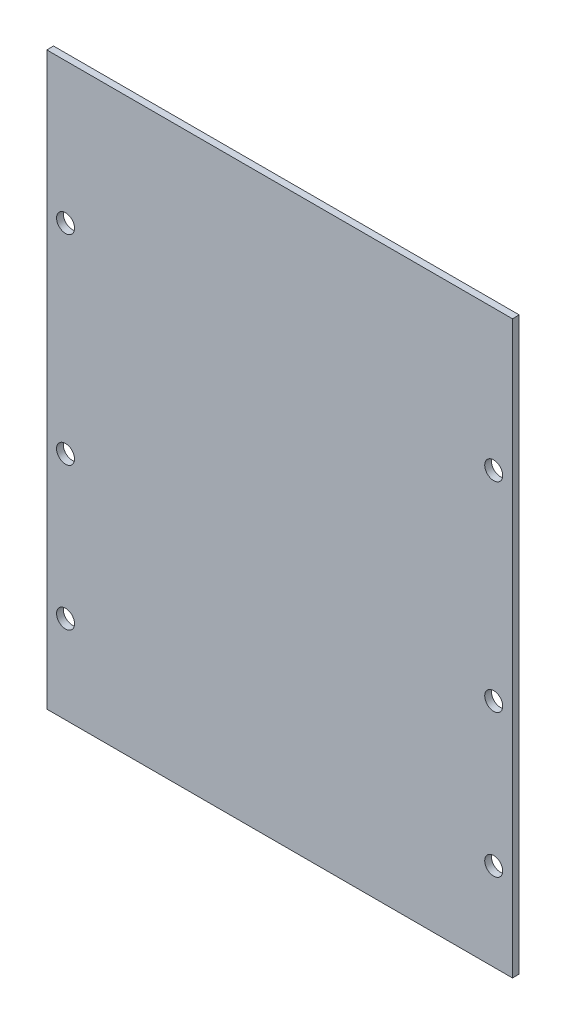
ISO-10303-21;
HEADER;
FILE_DESCRIPTION(('STEP AP214'),'2;1');
FILE_NAME('part.step','',(''),(''),'','','');
FILE_SCHEMA(('AUTOMOTIVE_DESIGN { 1 0 10303 214 1 1 1 1 }'));
ENDSEC;
DATA;
#1=APPLICATION_CONTEXT('core data for automotive mechanical design processes');
#2=APPLICATION_PROTOCOL_DEFINITION('international standard','automotive_design',2000,#1);
#3=PRODUCT_CONTEXT('',#1,'mechanical');
#4=PRODUCT('Part','Part','',(#3));
#5=PRODUCT_RELATED_PRODUCT_CATEGORY('part','',(#4));
#6=PRODUCT_DEFINITION_FORMATION('','',#4);
#7=PRODUCT_DEFINITION_CONTEXT('part definition',#1,'design');
#8=PRODUCT_DEFINITION('design','',#6,#7);
#9=PRODUCT_DEFINITION_SHAPE('','',#8);
#10=(LENGTH_UNIT() NAMED_UNIT(*) SI_UNIT(.MILLI.,.METRE.));
#11=(NAMED_UNIT(*) PLANE_ANGLE_UNIT() SI_UNIT($,.RADIAN.));
#12=(NAMED_UNIT(*) SI_UNIT($,.STERADIAN.) SOLID_ANGLE_UNIT());
#13=UNCERTAINTY_MEASURE_WITH_UNIT(LENGTH_MEASURE(1.E-05),#10,'distance_accuracy_value','');
#14=(GEOMETRIC_REPRESENTATION_CONTEXT(3) GLOBAL_UNCERTAINTY_ASSIGNED_CONTEXT((#13)) GLOBAL_UNIT_ASSIGNED_CONTEXT((#10,
#11,#12)) REPRESENTATION_CONTEXT('',''));
#15=CARTESIAN_POINT('',(0.,0.,0.));
#16=DIRECTION('',(0.,0.,1.));
#17=DIRECTION('',(1.,0.,0.));
#18=AXIS2_PLACEMENT_3D('',#15,#16,#17);
#19=CARTESIAN_POINT('',(0.,0.,1.5));
#20=DIRECTION('',(0.,0.,1.));
#21=DIRECTION('',(1.,0.,0.));
#22=AXIS2_PLACEMENT_3D('',#19,#20,#21);
#23=PLANE('',#22);
#24=CARTESIAN_POINT('',(47.625,-12.23,1.5));
#25=DIRECTION('',(0.,0.,1.));
#26=DIRECTION('',(1.,0.,0.));
#27=AXIS2_PLACEMENT_3D('',#24,#25,#26);
#28=CIRCLE('',#27,2.);
#29=CARTESIAN_POINT('',(49.625,-12.23,1.5));
#30=VERTEX_POINT('',#29);
#31=EDGE_CURVE('E137',#30,#30,#28,.T.);
#32=ORIENTED_EDGE('',*,*,#31,.F.);
#33=EDGE_LOOP('',(#32));
#34=FACE_BOUND('',#33,.T.);
#35=CARTESIAN_POINT('',(-47.625,32.22,1.5));
#36=DIRECTION('',(0.,0.,1.));
#37=DIRECTION('',(1.,0.,0.));
#38=AXIS2_PLACEMENT_3D('',#35,#36,#37);
#39=CIRCLE('',#38,2.);
#40=CARTESIAN_POINT('',(-45.625,32.22,1.5));
#41=VERTEX_POINT('',#40);
#42=EDGE_CURVE('E130',#41,#41,#39,.T.);
#43=ORIENTED_EDGE('',*,*,#42,.F.);
#44=EDGE_LOOP('',(#43));
#45=FACE_BOUND('',#44,.T.);
#46=CARTESIAN_POINT('',(-47.625,-43.98,1.5));
#47=DIRECTION('',(0.,0.,1.));
#48=DIRECTION('',(1.,0.,0.));
#49=AXIS2_PLACEMENT_3D('',#46,#47,#48);
#50=CIRCLE('',#49,2.);
#51=CARTESIAN_POINT('',(-45.625,-43.98,1.5));
#52=VERTEX_POINT('',#51);
#53=EDGE_CURVE('E108',#52,#52,#50,.T.);
#54=ORIENTED_EDGE('',*,*,#53,.F.);
#55=EDGE_LOOP('',(#54));
#56=FACE_BOUND('',#55,.T.);
#57=DIRECTION('',(1.,0.,0.));
#58=VECTOR('',#57,1.);
#59=CARTESIAN_POINT('',(51.8,-63.5,1.5));
#60=LINE('',#59,#58);
#61=CARTESIAN_POINT('',(-51.8,-63.5,1.5));
#62=VERTEX_POINT('',#61);
#63=CARTESIAN_POINT('',(51.8,-63.5,1.5));
#64=VERTEX_POINT('',#63);
#65=EDGE_CURVE('E91',#62,#64,#60,.T.);
#66=ORIENTED_EDGE('',*,*,#65,.T.);
#67=DIRECTION('',(0.,1.,0.));
#68=VECTOR('',#67,1.);
#69=CARTESIAN_POINT('',(51.8,63.5,1.5));
#70=LINE('',#69,#68);
#71=CARTESIAN_POINT('',(51.8,63.5,1.5));
#72=VERTEX_POINT('',#71);
#73=EDGE_CURVE('E86',#64,#72,#70,.T.);
#74=ORIENTED_EDGE('',*,*,#73,.T.);
#75=DIRECTION('',(-1.,0.,0.));
#76=VECTOR('',#75,1.);
#77=CARTESIAN_POINT('',(51.8,63.5,1.5));
#78=LINE('',#77,#76);
#79=CARTESIAN_POINT('',(-51.8,63.5,1.5));
#80=VERTEX_POINT('',#79);
#81=EDGE_CURVE('E87',#72,#80,#78,.T.);
#82=ORIENTED_EDGE('',*,*,#81,.T.);
#83=DIRECTION('',(0.,-1.,0.));
#84=VECTOR('',#83,1.);
#85=CARTESIAN_POINT('',(-51.8,63.5,1.5));
#86=LINE('',#85,#84);
#87=EDGE_CURVE('E57',#80,#62,#86,.T.);
#88=ORIENTED_EDGE('',*,*,#87,.T.);
#89=EDGE_LOOP('',(#66,#74,#82,#88));
#90=FACE_BOUND('',#89,.T.);
#91=CARTESIAN_POINT('',(-47.625,-12.23,1.5));
#92=DIRECTION('',(0.,0.,1.));
#93=DIRECTION('',(1.,0.,0.));
#94=AXIS2_PLACEMENT_3D('',#91,#92,#93);
#95=CIRCLE('',#94,2.);
#96=CARTESIAN_POINT('',(-45.625,-12.23,1.5));
#97=VERTEX_POINT('',#96);
#98=EDGE_CURVE('E123',#97,#97,#95,.T.);
#99=ORIENTED_EDGE('',*,*,#98,.F.);
#100=EDGE_LOOP('',(#99));
#101=FACE_BOUND('',#100,.T.);
#102=CARTESIAN_POINT('',(47.625,-43.98,1.5));
#103=DIRECTION('',(0.,0.,1.));
#104=DIRECTION('',(1.,0.,0.));
#105=AXIS2_PLACEMENT_3D('',#102,#103,#104);
#106=CIRCLE('',#105,2.);
#107=CARTESIAN_POINT('',(49.625,-43.98,1.5));
#108=VERTEX_POINT('',#107);
#109=EDGE_CURVE('E133',#108,#108,#106,.T.);
#110=ORIENTED_EDGE('',*,*,#109,.F.);
#111=EDGE_LOOP('',(#110));
#112=FACE_BOUND('',#111,.T.);
#113=CARTESIAN_POINT('',(47.625,32.22,1.5));
#114=DIRECTION('',(0.,0.,1.));
#115=DIRECTION('',(1.,0.,0.));
#116=AXIS2_PLACEMENT_3D('',#113,#114,#115);
#117=CIRCLE('',#116,2.);
#118=CARTESIAN_POINT('',(49.625,32.22,1.5));
#119=VERTEX_POINT('',#118);
#120=EDGE_CURVE('E144',#119,#119,#117,.T.);
#121=ORIENTED_EDGE('',*,*,#120,.F.);
#122=EDGE_LOOP('',(#121));
#123=FACE_BOUND('',#122,.T.);
#124=ADVANCED_FACE('F39',(#34,#45,#56,#90,#101,#112,#123),#23,.T.);
#125=CARTESIAN_POINT('',(0.,0.,0.));
#126=DIRECTION('',(0.,0.,1.));
#127=DIRECTION('',(1.,0.,0.));
#128=AXIS2_PLACEMENT_3D('',#125,#126,#127);
#129=PLANE('',#128);
#130=DIRECTION('',(1.,0.,0.));
#131=VECTOR('',#130,1.);
#132=CARTESIAN_POINT('',(51.8,-63.5,0.));
#133=LINE('',#132,#131);
#134=CARTESIAN_POINT('',(-51.8,-63.5,0.));
#135=VERTEX_POINT('',#134);
#136=CARTESIAN_POINT('',(51.8,-63.5,0.));
#137=VERTEX_POINT('',#136);
#138=EDGE_CURVE('E104',#135,#137,#133,.T.);
#139=ORIENTED_EDGE('',*,*,#138,.F.);
#140=DIRECTION('',(0.,-1.,0.));
#141=VECTOR('',#140,1.);
#142=CARTESIAN_POINT('',(-51.8,63.5,0.));
#143=LINE('',#142,#141);
#144=CARTESIAN_POINT('',(-51.8,63.5,0.));
#145=VERTEX_POINT('',#144);
#146=EDGE_CURVE('E80',#145,#135,#143,.T.);
#147=ORIENTED_EDGE('',*,*,#146,.F.);
#148=DIRECTION('',(-1.,0.,0.));
#149=VECTOR('',#148,1.);
#150=CARTESIAN_POINT('',(51.8,63.5,0.));
#151=LINE('',#150,#149);
#152=CARTESIAN_POINT('',(51.8,63.5,0.));
#153=VERTEX_POINT('',#152);
#154=EDGE_CURVE('E71',#153,#145,#151,.T.);
#155=ORIENTED_EDGE('',*,*,#154,.F.);
#156=DIRECTION('',(0.,1.,0.));
#157=VECTOR('',#156,1.);
#158=CARTESIAN_POINT('',(51.8,63.5,0.));
#159=LINE('',#158,#157);
#160=EDGE_CURVE('E94',#137,#153,#159,.T.);
#161=ORIENTED_EDGE('',*,*,#160,.F.);
#162=EDGE_LOOP('',(#139,#147,#155,#161));
#163=FACE_BOUND('',#162,.T.);
#164=CARTESIAN_POINT('',(-47.625,-43.98,0.));
#165=DIRECTION('',(0.,0.,1.));
#166=DIRECTION('',(1.,0.,0.));
#167=AXIS2_PLACEMENT_3D('',#164,#165,#166);
#168=CIRCLE('',#167,2.);
#169=CARTESIAN_POINT('',(-45.625,-43.98,0.));
#170=VERTEX_POINT('',#169);
#171=EDGE_CURVE('E116',#170,#170,#168,.T.);
#172=ORIENTED_EDGE('',*,*,#171,.T.);
#173=EDGE_LOOP('',(#172));
#174=FACE_BOUND('',#173,.T.);
#175=CARTESIAN_POINT('',(-47.625,-12.23,0.));
#176=DIRECTION('',(0.,0.,1.));
#177=DIRECTION('',(1.,0.,0.));
#178=AXIS2_PLACEMENT_3D('',#175,#176,#177);
#179=CIRCLE('',#178,2.);
#180=CARTESIAN_POINT('',(-45.625,-12.23,0.));
#181=VERTEX_POINT('',#180);
#182=EDGE_CURVE('E125',#181,#181,#179,.T.);
#183=ORIENTED_EDGE('',*,*,#182,.T.);
#184=EDGE_LOOP('',(#183));
#185=FACE_BOUND('',#184,.T.);
#186=CARTESIAN_POINT('',(-47.625,32.22,0.));
#187=DIRECTION('',(0.,0.,1.));
#188=DIRECTION('',(1.,0.,0.));
#189=AXIS2_PLACEMENT_3D('',#186,#187,#188);
#190=CIRCLE('',#189,2.);
#191=CARTESIAN_POINT('',(-45.625,32.22,0.));
#192=VERTEX_POINT('',#191);
#193=EDGE_CURVE('E127',#192,#192,#190,.T.);
#194=ORIENTED_EDGE('',*,*,#193,.T.);
#195=EDGE_LOOP('',(#194));
#196=FACE_BOUND('',#195,.T.);
#197=CARTESIAN_POINT('',(47.625,-43.98,0.));
#198=DIRECTION('',(0.,0.,1.));
#199=DIRECTION('',(1.,0.,0.));
#200=AXIS2_PLACEMENT_3D('',#197,#198,#199);
#201=CIRCLE('',#200,2.);
#202=CARTESIAN_POINT('',(49.625,-43.98,0.));
#203=VERTEX_POINT('',#202);
#204=EDGE_CURVE('E136',#203,#203,#201,.T.);
#205=ORIENTED_EDGE('',*,*,#204,.T.);
#206=EDGE_LOOP('',(#205));
#207=FACE_BOUND('',#206,.T.);
#208=CARTESIAN_POINT('',(47.625,-12.23,0.));
#209=DIRECTION('',(0.,0.,1.));
#210=DIRECTION('',(1.,0.,0.));
#211=AXIS2_PLACEMENT_3D('',#208,#209,#210);
#212=CIRCLE('',#211,2.);
#213=CARTESIAN_POINT('',(49.625,-12.23,0.));
#214=VERTEX_POINT('',#213);
#215=EDGE_CURVE('E145',#214,#214,#212,.T.);
#216=ORIENTED_EDGE('',*,*,#215,.T.);
#217=EDGE_LOOP('',(#216));
#218=FACE_BOUND('',#217,.T.);
#219=CARTESIAN_POINT('',(47.625,32.22,0.));
#220=DIRECTION('',(0.,0.,1.));
#221=DIRECTION('',(1.,0.,0.));
#222=AXIS2_PLACEMENT_3D('',#219,#220,#221);
#223=CIRCLE('',#222,2.);
#224=CARTESIAN_POINT('',(49.625,32.22,0.));
#225=VERTEX_POINT('',#224);
#226=EDGE_CURVE('E149',#225,#225,#223,.T.);
#227=ORIENTED_EDGE('',*,*,#226,.T.);
#228=EDGE_LOOP('',(#227));
#229=FACE_BOUND('',#228,.T.);
#230=ADVANCED_FACE('F114',(#163,#174,#185,#196,#207,#218,#229),#129,.F.);
#231=CARTESIAN_POINT('',(51.8,-63.5,1.5));
#232=DIRECTION('',(0.,1.,0.));
#233=DIRECTION('',(0.,0.,1.));
#234=AXIS2_PLACEMENT_3D('',#231,#232,#233);
#235=PLANE('',#234);
#236=ORIENTED_EDGE('',*,*,#138,.T.);
#237=DIRECTION('',(0.,0.,-1.));
#238=VECTOR('',#237,1.);
#239=CARTESIAN_POINT('',(51.8,-63.5,1.5));
#240=LINE('',#239,#238);
#241=EDGE_CURVE('E11',#64,#137,#240,.T.);
#242=ORIENTED_EDGE('',*,*,#241,.F.);
#243=ORIENTED_EDGE('',*,*,#65,.F.);
#244=DIRECTION('',(0.,0.,-1.));
#245=VECTOR('',#244,1.);
#246=CARTESIAN_POINT('',(-51.8,-63.5,1.5));
#247=LINE('',#246,#245);
#248=EDGE_CURVE('E98',#62,#135,#247,.T.);
#249=ORIENTED_EDGE('',*,*,#248,.T.);
#250=EDGE_LOOP('',(#236,#242,#243,#249));
#251=FACE_BOUND('',#250,.T.);
#252=ADVANCED_FACE('F41',(#251),#235,.F.);
#253=CARTESIAN_POINT('',(51.8,63.5,1.5));
#254=DIRECTION('',(-1.,0.,0.));
#255=DIRECTION('',(0.,0.,1.));
#256=AXIS2_PLACEMENT_3D('',#253,#254,#255);
#257=PLANE('',#256);
#258=ORIENTED_EDGE('',*,*,#160,.T.);
#259=DIRECTION('',(0.,0.,-1.));
#260=VECTOR('',#259,1.);
#261=CARTESIAN_POINT('',(51.8,63.5,1.5));
#262=LINE('',#261,#260);
#263=EDGE_CURVE('E48',#72,#153,#262,.T.);
#264=ORIENTED_EDGE('',*,*,#263,.F.);
#265=ORIENTED_EDGE('',*,*,#73,.F.);
#266=ORIENTED_EDGE('',*,*,#241,.T.);
#267=EDGE_LOOP('',(#258,#264,#265,#266));
#268=FACE_BOUND('',#267,.T.);
#269=ADVANCED_FACE('F92',(#268),#257,.F.);
#270=CARTESIAN_POINT('',(51.8,63.5,1.5));
#271=DIRECTION('',(0.,-1.,0.));
#272=DIRECTION('',(0.,0.,-1.));
#273=AXIS2_PLACEMENT_3D('',#270,#271,#272);
#274=PLANE('',#273);
#275=ORIENTED_EDGE('',*,*,#154,.T.);
#276=DIRECTION('',(0.,0.,-1.));
#277=VECTOR('',#276,1.);
#278=CARTESIAN_POINT('',(-51.8,63.5,1.5));
#279=LINE('',#278,#277);
#280=EDGE_CURVE('E96',#80,#145,#279,.T.);
#281=ORIENTED_EDGE('',*,*,#280,.F.);
#282=ORIENTED_EDGE('',*,*,#81,.F.);
#283=ORIENTED_EDGE('',*,*,#263,.T.);
#284=EDGE_LOOP('',(#275,#281,#282,#283));
#285=FACE_BOUND('',#284,.T.);
#286=ADVANCED_FACE('F100',(#285),#274,.F.);
#287=CARTESIAN_POINT('',(-51.8,63.5,1.5));
#288=DIRECTION('',(1.,0.,0.));
#289=DIRECTION('',(0.,0.,-1.));
#290=AXIS2_PLACEMENT_3D('',#287,#288,#289);
#291=PLANE('',#290);
#292=ORIENTED_EDGE('',*,*,#146,.T.);
#293=ORIENTED_EDGE('',*,*,#248,.F.);
#294=ORIENTED_EDGE('',*,*,#87,.F.);
#295=ORIENTED_EDGE('',*,*,#280,.T.);
#296=EDGE_LOOP('',(#292,#293,#294,#295));
#297=FACE_BOUND('',#296,.T.);
#298=ADVANCED_FACE('F112',(#297),#291,.F.);
#299=CARTESIAN_POINT('',(-47.625,-43.98,1.5));
#300=DIRECTION('',(0.,0.,-1.));
#301=DIRECTION('',(-1.,0.,0.));
#302=AXIS2_PLACEMENT_3D('',#299,#300,#301);
#303=CYLINDRICAL_SURFACE('',#302,2.);
#304=ORIENTED_EDGE('',*,*,#53,.T.);
#305=EDGE_LOOP('',(#304));
#306=FACE_BOUND('',#305,.T.);
#307=ORIENTED_EDGE('',*,*,#171,.F.);
#308=EDGE_LOOP('',(#307));
#309=FACE_BOUND('',#308,.T.);
#310=ADVANCED_FACE('F167',(#306,#309),#303,.F.);
#311=CARTESIAN_POINT('',(-47.625,-12.23,1.5));
#312=DIRECTION('',(0.,0.,-1.));
#313=DIRECTION('',(-1.,0.,0.));
#314=AXIS2_PLACEMENT_3D('',#311,#312,#313);
#315=CYLINDRICAL_SURFACE('',#314,2.);
#316=ORIENTED_EDGE('',*,*,#98,.T.);
#317=EDGE_LOOP('',(#316));
#318=FACE_BOUND('',#317,.T.);
#319=ORIENTED_EDGE('',*,*,#182,.F.);
#320=EDGE_LOOP('',(#319));
#321=FACE_BOUND('',#320,.T.);
#322=ADVANCED_FACE('F212',(#318,#321),#315,.F.);
#323=CARTESIAN_POINT('',(-47.625,32.22,1.5));
#324=DIRECTION('',(0.,0.,-1.));
#325=DIRECTION('',(-1.,0.,0.));
#326=AXIS2_PLACEMENT_3D('',#323,#324,#325);
#327=CYLINDRICAL_SURFACE('',#326,2.);
#328=ORIENTED_EDGE('',*,*,#42,.T.);
#329=EDGE_LOOP('',(#328));
#330=FACE_BOUND('',#329,.T.);
#331=ORIENTED_EDGE('',*,*,#193,.F.);
#332=EDGE_LOOP('',(#331));
#333=FACE_BOUND('',#332,.T.);
#334=ADVANCED_FACE('F217',(#330,#333),#327,.F.);
#335=CARTESIAN_POINT('',(47.625,-43.98,1.5));
#336=DIRECTION('',(0.,0.,-1.));
#337=DIRECTION('',(-1.,0.,0.));
#338=AXIS2_PLACEMENT_3D('',#335,#336,#337);
#339=CYLINDRICAL_SURFACE('',#338,2.);
#340=ORIENTED_EDGE('',*,*,#109,.T.);
#341=EDGE_LOOP('',(#340));
#342=FACE_BOUND('',#341,.T.);
#343=ORIENTED_EDGE('',*,*,#204,.F.);
#344=EDGE_LOOP('',(#343));
#345=FACE_BOUND('',#344,.T.);
#346=ADVANCED_FACE('F228',(#342,#345),#339,.F.);
#347=CARTESIAN_POINT('',(47.625,-12.23,1.5));
#348=DIRECTION('',(0.,0.,-1.));
#349=DIRECTION('',(-1.,0.,0.));
#350=AXIS2_PLACEMENT_3D('',#347,#348,#349);
#351=CYLINDRICAL_SURFACE('',#350,2.);
#352=ORIENTED_EDGE('',*,*,#31,.T.);
#353=EDGE_LOOP('',(#352));
#354=FACE_BOUND('',#353,.T.);
#355=ORIENTED_EDGE('',*,*,#215,.F.);
#356=EDGE_LOOP('',(#355));
#357=FACE_BOUND('',#356,.T.);
#358=ADVANCED_FACE('F240',(#354,#357),#351,.F.);
#359=CARTESIAN_POINT('',(47.625,32.22,1.5));
#360=DIRECTION('',(0.,0.,-1.));
#361=DIRECTION('',(-1.,0.,0.));
#362=AXIS2_PLACEMENT_3D('',#359,#360,#361);
#363=CYLINDRICAL_SURFACE('',#362,2.);
#364=ORIENTED_EDGE('',*,*,#120,.T.);
#365=EDGE_LOOP('',(#364));
#366=FACE_BOUND('',#365,.T.);
#367=ORIENTED_EDGE('',*,*,#226,.F.);
#368=EDGE_LOOP('',(#367));
#369=FACE_BOUND('',#368,.T.);
#370=ADVANCED_FACE('F152',(#366,#369),#363,.F.);
#371=CLOSED_SHELL('',(#124,#230,#252,#269,#286,#298,#310,#322,#334,#346,#358,#370));
#372=MANIFOLD_SOLID_BREP('B2',#371);
#373=ADVANCED_BREP_SHAPE_REPRESENTATION('',(#18,#372),#14);
#374=SHAPE_DEFINITION_REPRESENTATION(#9,#373);
ENDSEC;
END-ISO-10303-21;
